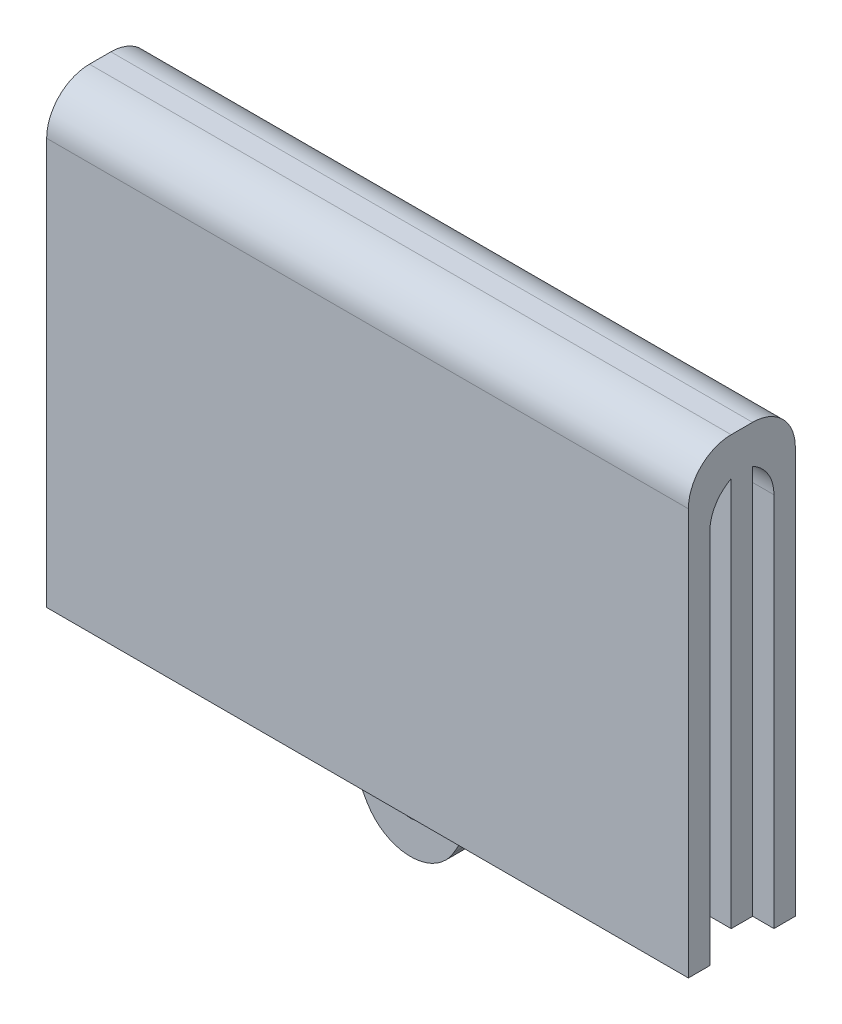
ISO-10303-21;
HEADER;
FILE_DESCRIPTION(('STEP AP214'),'2;1');
FILE_NAME('part.step','',(''),(''),'','','');
FILE_SCHEMA(('AUTOMOTIVE_DESIGN { 1 0 10303 214 1 1 1 1 }'));
ENDSEC;
DATA;
#1=APPLICATION_CONTEXT('core data for automotive mechanical design processes');
#2=APPLICATION_PROTOCOL_DEFINITION('international standard','automotive_design',2000,#1);
#3=PRODUCT_CONTEXT('',#1,'mechanical');
#4=PRODUCT('Part','Part','',(#3));
#5=PRODUCT_RELATED_PRODUCT_CATEGORY('part','',(#4));
#6=PRODUCT_DEFINITION_FORMATION('','',#4);
#7=PRODUCT_DEFINITION_CONTEXT('part definition',#1,'design');
#8=PRODUCT_DEFINITION('design','',#6,#7);
#9=PRODUCT_DEFINITION_SHAPE('','',#8);
#10=(LENGTH_UNIT() NAMED_UNIT(*) SI_UNIT(.MILLI.,.METRE.));
#11=(NAMED_UNIT(*) PLANE_ANGLE_UNIT() SI_UNIT($,.RADIAN.));
#12=(NAMED_UNIT(*) SI_UNIT($,.STERADIAN.) SOLID_ANGLE_UNIT());
#13=UNCERTAINTY_MEASURE_WITH_UNIT(LENGTH_MEASURE(1.E-05),#10,'distance_accuracy_value','');
#14=(GEOMETRIC_REPRESENTATION_CONTEXT(3) GLOBAL_UNCERTAINTY_ASSIGNED_CONTEXT((#13)) GLOBAL_UNIT_ASSIGNED_CONTEXT((#10,
#11,#12)) REPRESENTATION_CONTEXT('',''));
#15=CARTESIAN_POINT('',(0.,0.,0.));
#16=DIRECTION('',(0.,0.,1.));
#17=DIRECTION('',(1.,0.,0.));
#18=AXIS2_PLACEMENT_3D('',#15,#16,#17);
#19=CARTESIAN_POINT('',(-30.,40.,1.));
#20=DIRECTION('',(0.,0.,-1.));
#21=DIRECTION('',(-1.,0.,0.));
#22=AXIS2_PLACEMENT_3D('',#19,#20,#21);
#23=PLANE('',#22);
#24=CARTESIAN_POINT('',(0.0168395701474928,-4.49157611441039,1.));
#25=DIRECTION('',(0.,0.,-1.));
#26=DIRECTION('',(-1.,0.,0.));
#27=AXIS2_PLACEMENT_3D('',#24,#25,#26);
#28=CIRCLE('',#27,1.55);
#29=CARTESIAN_POINT('',(-1.53316042985251,-4.49157611441039,1.));
#30=VERTEX_POINT('',#29);
#31=EDGE_CURVE('E218',#30,#30,#28,.T.);
#32=ORIENTED_EDGE('',*,*,#31,.T.);
#33=EDGE_LOOP('',(#32));
#34=FACE_BOUND('',#33,.T.);
#35=DIRECTION('',(1.,0.,0.));
#36=VECTOR('',#35,1.);
#37=CARTESIAN_POINT('',(-30.,36.4381484104581,0.999999999999998));
#38=LINE('',#37,#36);
#39=CARTESIAN_POINT('',(-30.,36.4381484104581,1.));
#40=VERTEX_POINT('',#39);
#41=CARTESIAN_POINT('',(30.,36.4381484104581,0.999999999999998));
#42=VERTEX_POINT('',#41);
#43=EDGE_CURVE('E54',#40,#42,#38,.T.);
#44=ORIENTED_EDGE('',*,*,#43,.F.);
#45=DIRECTION('',(0.,-1.,0.));
#46=VECTOR('',#45,1.);
#47=CARTESIAN_POINT('',(-30.,40.,1.));
#48=LINE('',#47,#46);
#49=CARTESIAN_POINT('',(-30.,0.,1.));
#50=VERTEX_POINT('',#49);
#51=EDGE_CURVE('E308',#40,#50,#48,.T.);
#52=ORIENTED_EDGE('',*,*,#51,.T.);
#53=DIRECTION('',(1.,0.,0.));
#54=VECTOR('',#53,1.);
#55=CARTESIAN_POINT('',(-30.,0.,1.));
#56=LINE('',#55,#54);
#57=CARTESIAN_POINT('',(-7.96107829486734,0.,1.));
#58=VERTEX_POINT('',#57);
#59=EDGE_CURVE('E289',#50,#58,#56,.T.);
#60=ORIENTED_EDGE('',*,*,#59,.T.);
#61=DIRECTION('',(-0.499999999999998,0.86602540378444,0.));
#62=VECTOR('',#61,1.);
#63=CARTESIAN_POINT('',(-5.97080872115052,-3.447248022436,1.));
#64=LINE('',#63,#62);
#65=CARTESIAN_POINT('',(-4.02168931955825,-6.82322185601207,1.));
#66=VERTEX_POINT('',#65);
#67=EDGE_CURVE('E226',#66,#58,#64,.T.);
#68=ORIENTED_EDGE('',*,*,#67,.F.);
#69=CARTESIAN_POINT('',(0.0168395701474928,-4.49157611441039,1.));
#70=DIRECTION('',(0.,0.,-1.));
#71=DIRECTION('',(-1.,0.,0.));
#72=AXIS2_PLACEMENT_3D('',#69,#70,#71);
#73=CIRCLE('',#72,4.66329148320339);
#74=CARTESIAN_POINT('',(4.05536845985324,-6.8232218560121,1.));
#75=VERTEX_POINT('',#74);
#76=EDGE_CURVE('E223',#75,#66,#73,.T.);
#77=ORIENTED_EDGE('',*,*,#76,.F.);
#78=DIRECTION('',(0.500000000000004,0.866025403784436,0.));
#79=VECTOR('',#78,1.);
#80=CARTESIAN_POINT('',(5.99606807637177,-3.4618315179726,1.));
#81=LINE('',#80,#79);
#82=CARTESIAN_POINT('',(7.99475743516241,0.,1.));
#83=VERTEX_POINT('',#82);
#84=EDGE_CURVE('E221',#75,#83,#81,.T.);
#85=ORIENTED_EDGE('',*,*,#84,.T.);
#86=CARTESIAN_POINT('',(30.,0.,1.));
#87=VERTEX_POINT('',#86);
#88=EDGE_CURVE('E304',#83,#87,#56,.T.);
#89=ORIENTED_EDGE('',*,*,#88,.T.);
#90=DIRECTION('',(0.,-1.,0.));
#91=VECTOR('',#90,1.);
#92=CARTESIAN_POINT('',(30.,40.,1.));
#93=LINE('',#92,#91);
#94=EDGE_CURVE('E295',#42,#87,#93,.T.);
#95=ORIENTED_EDGE('',*,*,#94,.F.);
#96=EDGE_LOOP('',(#44,#52,#60,#68,#77,#85,#89,#95));
#97=FACE_BOUND('',#96,.T.);
#98=ADVANCED_FACE('F39',(#34,#97),#23,.F.);
#99=CARTESIAN_POINT('',(0.,0.,0.));
#100=DIRECTION('',(0.,-1.,0.));
#101=DIRECTION('',(0.,0.,-1.));
#102=AXIS2_PLACEMENT_3D('',#99,#100,#101);
#103=PLANE('',#102);
#104=ORIENTED_EDGE('',*,*,#88,.F.);
#105=DIRECTION('',(0.,0.,-1.));
#106=VECTOR('',#105,1.);
#107=CARTESIAN_POINT('',(7.99475743516241,0.,1.));
#108=LINE('',#107,#106);
#109=CARTESIAN_POINT('',(7.99475743516241,0.,-1.));
#110=VERTEX_POINT('',#109);
#111=EDGE_CURVE('E236',#83,#110,#108,.T.);
#112=ORIENTED_EDGE('',*,*,#111,.T.);
#113=DIRECTION('',(-1.,0.,0.));
#114=VECTOR('',#113,1.);
#115=CARTESIAN_POINT('',(-30.,0.,-1.));
#116=LINE('',#115,#114);
#117=CARTESIAN_POINT('',(30.,0.,-1.));
#118=VERTEX_POINT('',#117);
#119=EDGE_CURVE('E299',#118,#110,#116,.T.);
#120=ORIENTED_EDGE('',*,*,#119,.F.);
#121=DIRECTION('',(0.,0.,-1.));
#122=VECTOR('',#121,1.);
#123=CARTESIAN_POINT('',(30.,0.,1.));
#124=LINE('',#123,#122);
#125=EDGE_CURVE('E276',#87,#118,#124,.T.);
#126=ORIENTED_EDGE('',*,*,#125,.F.);
#127=EDGE_LOOP('',(#104,#112,#120,#126));
#128=FACE_BOUND('',#127,.T.);
#129=ADVANCED_FACE('F359',(#128),#103,.T.);
#130=CARTESIAN_POINT('',(30.,40.,1.));
#131=DIRECTION('',(-1.,0.,0.));
#132=DIRECTION('',(0.,0.,1.));
#133=AXIS2_PLACEMENT_3D('',#130,#131,#132);
#134=PLANE('',#133);
#135=ORIENTED_EDGE('',*,*,#125,.T.);
#136=DIRECTION('',(0.,-1.,0.));
#137=VECTOR('',#136,1.);
#138=CARTESIAN_POINT('',(30.,40.,-1.));
#139=LINE('',#138,#137);
#140=CARTESIAN_POINT('',(30.,36.4381484104581,-1.));
#141=VERTEX_POINT('',#140);
#142=EDGE_CURVE('E11',#141,#118,#139,.T.);
#143=ORIENTED_EDGE('',*,*,#142,.F.);
#144=CARTESIAN_POINT('',(30.,33.1344239159384,0.72864888392242));
#145=DIRECTION('',(-1.,0.,0.));
#146=DIRECTION('',(0.,0.,-1.));
#147=AXIS2_PLACEMENT_3D('',#144,#145,#146);
#148=CIRCLE('',#147,3.72864888392242);
#149=CARTESIAN_POINT('',(30.,33.1344239159384,-3.));
#150=VERTEX_POINT('',#149);
#151=EDGE_CURVE('E263',#141,#150,#148,.T.);
#152=ORIENTED_EDGE('',*,*,#151,.T.);
#153=DIRECTION('',(0.,-1.,0.));
#154=VECTOR('',#153,1.);
#155=CARTESIAN_POINT('',(30.,33.1344239159384,-3.));
#156=LINE('',#155,#154);
#157=CARTESIAN_POINT('',(30.,-1.99344008157751,-3.00000000000001));
#158=VERTEX_POINT('',#157);
#159=EDGE_CURVE('E266',#150,#158,#156,.T.);
#160=ORIENTED_EDGE('',*,*,#159,.T.);
#161=DIRECTION('',(0.,0.,-1.));
#162=VECTOR('',#161,1.);
#163=CARTESIAN_POINT('',(30.,-1.99344008157751,-3.00000000000001));
#164=LINE('',#163,#162);
#165=CARTESIAN_POINT('',(30.,-1.99344008157751,-5.00000000000001));
#166=VERTEX_POINT('',#165);
#167=EDGE_CURVE('E269',#158,#166,#164,.T.);
#168=ORIENTED_EDGE('',*,*,#167,.T.);
#169=DIRECTION('',(0.,1.,0.));
#170=VECTOR('',#169,1.);
#171=CARTESIAN_POINT('',(30.,36.,-5.));
#172=LINE('',#171,#170);
#173=CARTESIAN_POINT('',(30.,36.,-5.));
#174=VERTEX_POINT('',#173);
#175=EDGE_CURVE('E248',#166,#174,#172,.T.);
#176=ORIENTED_EDGE('',*,*,#175,.T.);
#177=CARTESIAN_POINT('',(30.,36.,-1.));
#178=DIRECTION('',(1.,0.,0.));
#179=DIRECTION('',(0.,0.,1.));
#180=AXIS2_PLACEMENT_3D('',#177,#178,#179);
#181=CIRCLE('',#180,4.);
#182=CARTESIAN_POINT('',(30.,40.,-1.));
#183=VERTEX_POINT('',#182);
#184=EDGE_CURVE('E239',#174,#183,#181,.T.);
#185=ORIENTED_EDGE('',*,*,#184,.T.);
#186=DIRECTION('',(0.,0.,-1.));
#187=VECTOR('',#186,1.);
#188=CARTESIAN_POINT('',(30.,40.,1.));
#189=LINE('',#188,#187);
#190=CARTESIAN_POINT('',(30.,40.,1.));
#191=VERTEX_POINT('',#190);
#192=EDGE_CURVE('E285',#191,#183,#189,.T.);
#193=ORIENTED_EDGE('',*,*,#192,.F.);
#194=CARTESIAN_POINT('',(30.,36.,0.999999999999998));
#195=DIRECTION('',(1.,0.,0.));
#196=DIRECTION('',(0.,0.,-1.));
#197=AXIS2_PLACEMENT_3D('',#194,#195,#196);
#198=CIRCLE('',#197,4.);
#199=CARTESIAN_POINT('',(30.,36.,5.));
#200=VERTEX_POINT('',#199);
#201=EDGE_CURVE('E203',#191,#200,#198,.T.);
#202=ORIENTED_EDGE('',*,*,#201,.T.);
#203=DIRECTION('',(0.,-1.,0.));
#204=VECTOR('',#203,1.);
#205=CARTESIAN_POINT('',(30.,36.,5.));
#206=LINE('',#205,#204);
#207=CARTESIAN_POINT('',(30.,-1.99344008157751,4.99999999999999));
#208=VERTEX_POINT('',#207);
#209=EDGE_CURVE('E169',#200,#208,#206,.T.);
#210=ORIENTED_EDGE('',*,*,#209,.T.);
#211=DIRECTION('',(0.,0.,-1.));
#212=VECTOR('',#211,1.);
#213=CARTESIAN_POINT('',(30.,-1.99344008157751,2.99999999999999));
#214=LINE('',#213,#212);
#215=CARTESIAN_POINT('',(30.,-1.99344008157751,2.99999999999999));
#216=VERTEX_POINT('',#215);
#217=EDGE_CURVE('E206',#208,#216,#214,.T.);
#218=ORIENTED_EDGE('',*,*,#217,.T.);
#219=DIRECTION('',(0.,1.,0.));
#220=VECTOR('',#219,1.);
#221=CARTESIAN_POINT('',(30.,33.1344239159384,3.));
#222=LINE('',#221,#220);
#223=CARTESIAN_POINT('',(30.,33.1344239159384,3.));
#224=VERTEX_POINT('',#223);
#225=EDGE_CURVE('E194',#216,#224,#222,.T.);
#226=ORIENTED_EDGE('',*,*,#225,.T.);
#227=CARTESIAN_POINT('',(30.,33.1344239159384,-0.728648883922424));
#228=DIRECTION('',(-1.,0.,0.));
#229=DIRECTION('',(0.,0.,1.));
#230=AXIS2_PLACEMENT_3D('',#227,#228,#229);
#231=CIRCLE('',#230,3.72864888392242);
#232=EDGE_CURVE('E191',#224,#42,#231,.T.);
#233=ORIENTED_EDGE('',*,*,#232,.T.);
#234=ORIENTED_EDGE('',*,*,#94,.T.);
#235=EDGE_LOOP('',(#135,#143,#152,#160,#168,#176,#185,#193,#202,#210,#218,#226,#233,#234));
#236=FACE_BOUND('',#235,.T.);
#237=ADVANCED_FACE('F41',(#236),#134,.F.);
#238=CARTESIAN_POINT('',(-30.,40.,-1.));
#239=DIRECTION('',(0.,0.,1.));
#240=DIRECTION('',(1.,0.,0.));
#241=AXIS2_PLACEMENT_3D('',#238,#239,#240);
#242=PLANE('',#241);
#243=DIRECTION('',(0.,-1.,0.));
#244=VECTOR('',#243,1.);
#245=CARTESIAN_POINT('',(-30.,40.,-1.));
#246=LINE('',#245,#244);
#247=CARTESIAN_POINT('',(-30.,36.4381484104581,-1.));
#248=VERTEX_POINT('',#247);
#249=CARTESIAN_POINT('',(-30.,0.,-1.));
#250=VERTEX_POINT('',#249);
#251=EDGE_CURVE('E47',#248,#250,#246,.T.);
#252=ORIENTED_EDGE('',*,*,#251,.F.);
#253=DIRECTION('',(1.,0.,0.));
#254=VECTOR('',#253,1.);
#255=CARTESIAN_POINT('',(-30.,36.4381484104581,-1.));
#256=LINE('',#255,#254);
#257=EDGE_CURVE('E260',#248,#141,#256,.T.);
#258=ORIENTED_EDGE('',*,*,#257,.T.);
#259=ORIENTED_EDGE('',*,*,#142,.T.);
#260=ORIENTED_EDGE('',*,*,#119,.T.);
#261=DIRECTION('',(0.500000000000004,0.866025403784436,0.));
#262=VECTOR('',#261,1.);
#263=CARTESIAN_POINT('',(5.99606807637177,-3.4618315179726,-1.));
#264=LINE('',#263,#262);
#265=CARTESIAN_POINT('',(4.05536845985324,-6.8232218560121,-1.));
#266=VERTEX_POINT('',#265);
#267=EDGE_CURVE('E231',#266,#110,#264,.T.);
#268=ORIENTED_EDGE('',*,*,#267,.F.);
#269=CARTESIAN_POINT('',(0.0168395701474928,-4.49157611441039,-1.));
#270=DIRECTION('',(0.,0.,-1.));
#271=DIRECTION('',(-1.,0.,0.));
#272=AXIS2_PLACEMENT_3D('',#269,#270,#271);
#273=CIRCLE('',#272,4.66329148320339);
#274=CARTESIAN_POINT('',(-4.02168931955825,-6.82322185601207,-1.));
#275=VERTEX_POINT('',#274);
#276=EDGE_CURVE('E233',#266,#275,#273,.T.);
#277=ORIENTED_EDGE('',*,*,#276,.T.);
#278=DIRECTION('',(-0.499999999999998,0.86602540378444,0.));
#279=VECTOR('',#278,1.);
#280=CARTESIAN_POINT('',(-5.97080872115052,-3.447248022436,-1.));
#281=LINE('',#280,#279);
#282=CARTESIAN_POINT('',(-7.96107829486734,0.,-1.));
#283=VERTEX_POINT('',#282);
#284=EDGE_CURVE('E62',#275,#283,#281,.T.);
#285=ORIENTED_EDGE('',*,*,#284,.T.);
#286=EDGE_CURVE('E298',#283,#250,#116,.T.);
#287=ORIENTED_EDGE('',*,*,#286,.T.);
#288=EDGE_LOOP('',(#252,#258,#259,#260,#268,#277,#285,#287));
#289=FACE_BOUND('',#288,.T.);
#290=CARTESIAN_POINT('',(0.0168395701474928,-4.49157611441039,-1.));
#291=DIRECTION('',(0.,0.,-1.));
#292=DIRECTION('',(-1.,0.,0.));
#293=AXIS2_PLACEMENT_3D('',#290,#291,#292);
#294=CIRCLE('',#293,1.55);
#295=CARTESIAN_POINT('',(-1.53316042985251,-4.49157611441039,-1.));
#296=VERTEX_POINT('',#295);
#297=EDGE_CURVE('E212',#296,#296,#294,.T.);
#298=ORIENTED_EDGE('',*,*,#297,.F.);
#299=EDGE_LOOP('',(#298));
#300=FACE_BOUND('',#299,.T.);
#301=ADVANCED_FACE('F352',(#289,#300),#242,.F.);
#302=CARTESIAN_POINT('',(-30.,40.,1.));
#303=DIRECTION('',(1.,0.,0.));
#304=DIRECTION('',(0.,0.,-1.));
#305=AXIS2_PLACEMENT_3D('',#302,#303,#304);
#306=PLANE('',#305);
#307=DIRECTION('',(0.,0.,1.));
#308=VECTOR('',#307,1.);
#309=CARTESIAN_POINT('',(-30.,0.,1.));
#310=LINE('',#309,#308);
#311=EDGE_CURVE('E302',#250,#50,#310,.T.);
#312=ORIENTED_EDGE('',*,*,#311,.T.);
#313=ORIENTED_EDGE('',*,*,#51,.F.);
#314=CARTESIAN_POINT('',(-30.,33.1344239159384,-0.728648883922424));
#315=DIRECTION('',(-1.,0.,0.));
#316=DIRECTION('',(0.,0.,1.));
#317=AXIS2_PLACEMENT_3D('',#314,#315,#316);
#318=CIRCLE('',#317,3.72864888392242);
#319=CARTESIAN_POINT('',(-30.,33.1344239159384,3.));
#320=VERTEX_POINT('',#319);
#321=EDGE_CURVE('E175',#320,#40,#318,.T.);
#322=ORIENTED_EDGE('',*,*,#321,.F.);
#323=DIRECTION('',(0.,1.,0.));
#324=VECTOR('',#323,1.);
#325=CARTESIAN_POINT('',(-30.,33.1344239159384,3.));
#326=LINE('',#325,#324);
#327=CARTESIAN_POINT('',(-30.,-1.99344008157751,2.99999999999999));
#328=VERTEX_POINT('',#327);
#329=EDGE_CURVE('E198',#328,#320,#326,.T.);
#330=ORIENTED_EDGE('',*,*,#329,.F.);
#331=DIRECTION('',(0.,0.,-1.));
#332=VECTOR('',#331,1.);
#333=CARTESIAN_POINT('',(-30.,-1.99344008157751,2.99999999999999));
#334=LINE('',#333,#332);
#335=CARTESIAN_POINT('',(-30.,-1.99344008157751,4.99999999999999));
#336=VERTEX_POINT('',#335);
#337=EDGE_CURVE('E186',#336,#328,#334,.T.);
#338=ORIENTED_EDGE('',*,*,#337,.F.);
#339=DIRECTION('',(0.,-1.,0.));
#340=VECTOR('',#339,1.);
#341=CARTESIAN_POINT('',(-30.,36.,5.));
#342=LINE('',#341,#340);
#343=CARTESIAN_POINT('',(-30.,36.,5.));
#344=VERTEX_POINT('',#343);
#345=EDGE_CURVE('E167',#344,#336,#342,.T.);
#346=ORIENTED_EDGE('',*,*,#345,.F.);
#347=CARTESIAN_POINT('',(-30.,36.,0.999999999999998));
#348=DIRECTION('',(1.,0.,0.));
#349=DIRECTION('',(0.,0.,-1.));
#350=AXIS2_PLACEMENT_3D('',#347,#348,#349);
#351=CIRCLE('',#350,4.);
#352=CARTESIAN_POINT('',(-30.,40.,1.));
#353=VERTEX_POINT('',#352);
#354=EDGE_CURVE('E183',#353,#344,#351,.T.);
#355=ORIENTED_EDGE('',*,*,#354,.F.);
#356=DIRECTION('',(0.,0.,1.));
#357=VECTOR('',#356,1.);
#358=CARTESIAN_POINT('',(-30.,40.,1.));
#359=LINE('',#358,#357);
#360=CARTESIAN_POINT('',(-30.,40.,-1.));
#361=VERTEX_POINT('',#360);
#362=EDGE_CURVE('E292',#361,#353,#359,.T.);
#363=ORIENTED_EDGE('',*,*,#362,.F.);
#364=CARTESIAN_POINT('',(-30.,36.,-1.));
#365=DIRECTION('',(1.,0.,0.));
#366=DIRECTION('',(0.,0.,1.));
#367=AXIS2_PLACEMENT_3D('',#364,#365,#366);
#368=CIRCLE('',#367,4.);
#369=CARTESIAN_POINT('',(-30.,36.,-5.));
#370=VERTEX_POINT('',#369);
#371=EDGE_CURVE('E245',#370,#361,#368,.T.);
#372=ORIENTED_EDGE('',*,*,#371,.F.);
#373=DIRECTION('',(0.,1.,0.));
#374=VECTOR('',#373,1.);
#375=CARTESIAN_POINT('',(-30.,36.,-5.));
#376=LINE('',#375,#374);
#377=CARTESIAN_POINT('',(-30.,-1.99344008157751,-5.00000000000001));
#378=VERTEX_POINT('',#377);
#379=EDGE_CURVE('E257',#378,#370,#376,.T.);
#380=ORIENTED_EDGE('',*,*,#379,.F.);
#381=DIRECTION('',(0.,0.,-1.));
#382=VECTOR('',#381,1.);
#383=CARTESIAN_POINT('',(-30.,-1.99344008157751,-3.00000000000001));
#384=LINE('',#383,#382);
#385=CARTESIAN_POINT('',(-30.,-1.99344008157751,-3.00000000000001));
#386=VERTEX_POINT('',#385);
#387=EDGE_CURVE('E254',#386,#378,#384,.T.);
#388=ORIENTED_EDGE('',*,*,#387,.F.);
#389=DIRECTION('',(0.,-1.,0.));
#390=VECTOR('',#389,1.);
#391=CARTESIAN_POINT('',(-30.,33.1344239159384,-3.));
#392=LINE('',#391,#390);
#393=CARTESIAN_POINT('',(-30.,33.1344239159384,-3.));
#394=VERTEX_POINT('',#393);
#395=EDGE_CURVE('E251',#394,#386,#392,.T.);
#396=ORIENTED_EDGE('',*,*,#395,.F.);
#397=CARTESIAN_POINT('',(-30.,33.1344239159384,0.72864888392242));
#398=DIRECTION('',(-1.,0.,0.));
#399=DIRECTION('',(0.,0.,-1.));
#400=AXIS2_PLACEMENT_3D('',#397,#398,#399);
#401=CIRCLE('',#400,3.72864888392242);
#402=EDGE_CURVE('E247',#248,#394,#401,.T.);
#403=ORIENTED_EDGE('',*,*,#402,.F.);
#404=ORIENTED_EDGE('',*,*,#251,.T.);
#405=EDGE_LOOP('',(#312,#313,#322,#330,#338,#346,#355,#363,#372,#380,#388,#396,#403,#404));
#406=FACE_BOUND('',#405,.T.);
#407=ADVANCED_FACE('F181',(#406),#306,.F.);
#408=CARTESIAN_POINT('',(0.,40.,0.));
#409=DIRECTION('',(0.,-1.,0.));
#410=DIRECTION('',(0.,0.,-1.));
#411=AXIS2_PLACEMENT_3D('',#408,#409,#410);
#412=PLANE('',#411);
#413=ORIENTED_EDGE('',*,*,#192,.T.);
#414=DIRECTION('',(-1.,0.,0.));
#415=VECTOR('',#414,1.);
#416=CARTESIAN_POINT('',(-30.,40.,-1.));
#417=LINE('',#416,#415);
#418=EDGE_CURVE('E288',#183,#361,#417,.T.);
#419=ORIENTED_EDGE('',*,*,#418,.T.);
#420=ORIENTED_EDGE('',*,*,#362,.T.);
#421=DIRECTION('',(1.,0.,0.));
#422=VECTOR('',#421,1.);
#423=CARTESIAN_POINT('',(-30.,40.,1.));
#424=LINE('',#423,#422);
#425=EDGE_CURVE('E190',#353,#191,#424,.T.);
#426=ORIENTED_EDGE('',*,*,#425,.T.);
#427=EDGE_LOOP('',(#413,#419,#420,#426));
#428=FACE_BOUND('',#427,.T.);
#429=ADVANCED_FACE('F335',(#428),#412,.F.);
#430=DIRECTION('',(0.,0.,-1.));
#431=VECTOR('',#430,1.);
#432=CARTESIAN_POINT('',(-7.96107829486734,0.,1.));
#433=LINE('',#432,#431);
#434=EDGE_CURVE('E240',#58,#283,#433,.T.);
#435=ORIENTED_EDGE('',*,*,#434,.F.);
#436=ORIENTED_EDGE('',*,*,#59,.F.);
#437=ORIENTED_EDGE('',*,*,#311,.F.);
#438=ORIENTED_EDGE('',*,*,#286,.F.);
#439=EDGE_LOOP('',(#435,#436,#437,#438));
#440=FACE_BOUND('',#439,.T.);
#441=ADVANCED_FACE('F318',(#440),#103,.T.);
#442=CARTESIAN_POINT('',(-30.,36.,-1.));
#443=DIRECTION('',(1.,0.,0.));
#444=DIRECTION('',(0.,0.,-1.));
#445=AXIS2_PLACEMENT_3D('',#442,#443,#444);
#446=CYLINDRICAL_SURFACE('',#445,4.);
#447=ORIENTED_EDGE('',*,*,#184,.F.);
#448=DIRECTION('',(1.,0.,0.));
#449=VECTOR('',#448,1.);
#450=CARTESIAN_POINT('',(-30.,36.,-5.));
#451=LINE('',#450,#449);
#452=EDGE_CURVE('E274',#370,#174,#451,.T.);
#453=ORIENTED_EDGE('',*,*,#452,.F.);
#454=ORIENTED_EDGE('',*,*,#371,.T.);
#455=ORIENTED_EDGE('',*,*,#418,.F.);
#456=EDGE_LOOP('',(#447,#453,#454,#455));
#457=FACE_BOUND('',#456,.T.);
#458=ADVANCED_FACE('F439',(#457),#446,.T.);
#459=CARTESIAN_POINT('',(-30.,36.,-5.));
#460=DIRECTION('',(0.,0.,-1.));
#461=DIRECTION('',(0.,1.,0.));
#462=AXIS2_PLACEMENT_3D('',#459,#460,#461);
#463=PLANE('',#462);
#464=ORIENTED_EDGE('',*,*,#175,.F.);
#465=DIRECTION('',(1.,0.,0.));
#466=VECTOR('',#465,1.);
#467=CARTESIAN_POINT('',(-30.,-1.99344008157751,-5.00000000000001));
#468=LINE('',#467,#466);
#469=EDGE_CURVE('E277',#378,#166,#468,.T.);
#470=ORIENTED_EDGE('',*,*,#469,.F.);
#471=ORIENTED_EDGE('',*,*,#379,.T.);
#472=ORIENTED_EDGE('',*,*,#452,.T.);
#473=EDGE_LOOP('',(#464,#470,#471,#472));
#474=FACE_BOUND('',#473,.T.);
#475=ADVANCED_FACE('F342',(#474),#463,.T.);
#476=CARTESIAN_POINT('',(-30.,-1.99344008157751,-3.00000000000001));
#477=DIRECTION('',(0.,-1.,0.));
#478=DIRECTION('',(0.,0.,-1.));
#479=AXIS2_PLACEMENT_3D('',#476,#477,#478);
#480=PLANE('',#479);
#481=ORIENTED_EDGE('',*,*,#167,.F.);
#482=DIRECTION('',(1.,0.,0.));
#483=VECTOR('',#482,1.);
#484=CARTESIAN_POINT('',(-30.,-1.99344008157751,-3.00000000000001));
#485=LINE('',#484,#483);
#486=EDGE_CURVE('E279',#386,#158,#485,.T.);
#487=ORIENTED_EDGE('',*,*,#486,.F.);
#488=ORIENTED_EDGE('',*,*,#387,.T.);
#489=ORIENTED_EDGE('',*,*,#469,.T.);
#490=EDGE_LOOP('',(#481,#487,#488,#489));
#491=FACE_BOUND('',#490,.T.);
#492=ADVANCED_FACE('F345',(#491),#480,.T.);
#493=CARTESIAN_POINT('',(-30.,33.1344239159384,-3.));
#494=DIRECTION('',(0.,0.,1.));
#495=DIRECTION('',(0.,-1.,0.));
#496=AXIS2_PLACEMENT_3D('',#493,#494,#495);
#497=PLANE('',#496);
#498=ORIENTED_EDGE('',*,*,#159,.F.);
#499=DIRECTION('',(1.,0.,0.));
#500=VECTOR('',#499,1.);
#501=CARTESIAN_POINT('',(-30.,33.1344239159384,-3.));
#502=LINE('',#501,#500);
#503=EDGE_CURVE('E281',#394,#150,#502,.T.);
#504=ORIENTED_EDGE('',*,*,#503,.F.);
#505=ORIENTED_EDGE('',*,*,#395,.T.);
#506=ORIENTED_EDGE('',*,*,#486,.T.);
#507=EDGE_LOOP('',(#498,#504,#505,#506));
#508=FACE_BOUND('',#507,.T.);
#509=ADVANCED_FACE('F348',(#508),#497,.T.);
#510=CARTESIAN_POINT('',(-30.,33.1344239159384,0.72864888392242));
#511=DIRECTION('',(1.,0.,0.));
#512=DIRECTION('',(0.,0.,-1.));
#513=AXIS2_PLACEMENT_3D('',#510,#511,#512);
#514=CYLINDRICAL_SURFACE('',#513,3.72864888392242);
#515=ORIENTED_EDGE('',*,*,#151,.F.);
#516=ORIENTED_EDGE('',*,*,#257,.F.);
#517=ORIENTED_EDGE('',*,*,#402,.T.);
#518=ORIENTED_EDGE('',*,*,#503,.T.);
#519=EDGE_LOOP('',(#515,#516,#517,#518));
#520=FACE_BOUND('',#519,.T.);
#521=ADVANCED_FACE('F350',(#520),#514,.F.);
#522=CARTESIAN_POINT('',(5.99606807637177,-3.4618315179726,1.));
#523=DIRECTION('',(-0.866025403784436,0.500000000000004,0.));
#524=DIRECTION('',(-0.500000000000004,-0.866025403784436,0.));
#525=AXIS2_PLACEMENT_3D('',#522,#523,#524);
#526=PLANE('',#525);
#527=ORIENTED_EDGE('',*,*,#267,.T.);
#528=ORIENTED_EDGE('',*,*,#111,.F.);
#529=ORIENTED_EDGE('',*,*,#84,.F.);
#530=DIRECTION('',(0.,0.,-1.));
#531=VECTOR('',#530,1.);
#532=CARTESIAN_POINT('',(4.05536845985324,-6.8232218560121,1.));
#533=LINE('',#532,#531);
#534=EDGE_CURVE('E228',#75,#266,#533,.T.);
#535=ORIENTED_EDGE('',*,*,#534,.T.);
#536=EDGE_LOOP('',(#527,#528,#529,#535));
#537=FACE_BOUND('',#536,.T.);
#538=ADVANCED_FACE('F371',(#537),#526,.F.);
#539=CARTESIAN_POINT('',(-5.97080872115052,-3.447248022436,1.));
#540=DIRECTION('',(-0.86602540378444,-0.499999999999998,0.));
#541=DIRECTION('',(0.499999999999998,-0.86602540378444,0.));
#542=AXIS2_PLACEMENT_3D('',#539,#540,#541);
#543=PLANE('',#542);
#544=ORIENTED_EDGE('',*,*,#284,.F.);
#545=DIRECTION('',(0.,0.,-1.));
#546=VECTOR('',#545,1.);
#547=CARTESIAN_POINT('',(-4.02168931955825,-6.82322185601207,1.));
#548=LINE('',#547,#546);
#549=EDGE_CURVE('E242',#66,#275,#548,.T.);
#550=ORIENTED_EDGE('',*,*,#549,.F.);
#551=ORIENTED_EDGE('',*,*,#67,.T.);
#552=ORIENTED_EDGE('',*,*,#434,.T.);
#553=EDGE_LOOP('',(#544,#550,#551,#552));
#554=FACE_BOUND('',#553,.T.);
#555=ADVANCED_FACE('F368',(#554),#543,.T.);
#556=CARTESIAN_POINT('',(0.0168395701474928,-4.49157611441039,1.));
#557=DIRECTION('',(0.,0.,-1.));
#558=DIRECTION('',(-1.,0.,0.));
#559=AXIS2_PLACEMENT_3D('',#556,#557,#558);
#560=CYLINDRICAL_SURFACE('',#559,1.55);
#561=ORIENTED_EDGE('',*,*,#31,.F.);
#562=EDGE_LOOP('',(#561));
#563=FACE_BOUND('',#562,.T.);
#564=ORIENTED_EDGE('',*,*,#297,.T.);
#565=EDGE_LOOP('',(#564));
#566=FACE_BOUND('',#565,.T.);
#567=ADVANCED_FACE('F370',(#563,#566),#560,.F.);
#568=CARTESIAN_POINT('',(0.0168395701474928,-4.49157611441039,1.));
#569=DIRECTION('',(0.,0.,-1.));
#570=DIRECTION('',(-1.,0.,0.));
#571=AXIS2_PLACEMENT_3D('',#568,#569,#570);
#572=CYLINDRICAL_SURFACE('',#571,4.66329148320339);
#573=ORIENTED_EDGE('',*,*,#276,.F.);
#574=ORIENTED_EDGE('',*,*,#534,.F.);
#575=ORIENTED_EDGE('',*,*,#76,.T.);
#576=ORIENTED_EDGE('',*,*,#549,.T.);
#577=EDGE_LOOP('',(#573,#574,#575,#576));
#578=FACE_BOUND('',#577,.T.);
#579=ADVANCED_FACE('F365',(#578),#572,.T.);
#580=CARTESIAN_POINT('',(-30.,36.,0.999999999999998));
#581=DIRECTION('',(1.,0.,0.));
#582=DIRECTION('',(0.,0.,-1.));
#583=AXIS2_PLACEMENT_3D('',#580,#581,#582);
#584=CYLINDRICAL_SURFACE('',#583,4.);
#585=ORIENTED_EDGE('',*,*,#201,.F.);
#586=ORIENTED_EDGE('',*,*,#425,.F.);
#587=ORIENTED_EDGE('',*,*,#354,.T.);
#588=DIRECTION('',(1.,0.,0.));
#589=VECTOR('',#588,1.);
#590=CARTESIAN_POINT('',(-30.,36.,5.));
#591=LINE('',#590,#589);
#592=EDGE_CURVE('E164',#344,#200,#591,.T.);
#593=ORIENTED_EDGE('',*,*,#592,.T.);
#594=EDGE_LOOP('',(#585,#586,#587,#593));
#595=FACE_BOUND('',#594,.T.);
#596=ADVANCED_FACE('F189',(#595),#584,.T.);
#597=CARTESIAN_POINT('',(-30.,33.1344239159384,-0.728648883922424));
#598=DIRECTION('',(1.,0.,0.));
#599=DIRECTION('',(0.,0.,-1.));
#600=AXIS2_PLACEMENT_3D('',#597,#598,#599);
#601=CYLINDRICAL_SURFACE('',#600,3.72864888392242);
#602=ORIENTED_EDGE('',*,*,#232,.F.);
#603=DIRECTION('',(1.,0.,0.));
#604=VECTOR('',#603,1.);
#605=CARTESIAN_POINT('',(-30.,33.1344239159384,3.));
#606=LINE('',#605,#604);
#607=EDGE_CURVE('E213',#320,#224,#606,.T.);
#608=ORIENTED_EDGE('',*,*,#607,.F.);
#609=ORIENTED_EDGE('',*,*,#321,.T.);
#610=ORIENTED_EDGE('',*,*,#43,.T.);
#611=EDGE_LOOP('',(#602,#608,#609,#610));
#612=FACE_BOUND('',#611,.T.);
#613=ADVANCED_FACE('F324',(#612),#601,.F.);
#614=CARTESIAN_POINT('',(-30.,33.1344239159384,3.));
#615=DIRECTION('',(0.,0.,-1.));
#616=DIRECTION('',(0.,1.,0.));
#617=AXIS2_PLACEMENT_3D('',#614,#615,#616);
#618=PLANE('',#617);
#619=ORIENTED_EDGE('',*,*,#225,.F.);
#620=DIRECTION('',(1.,0.,0.));
#621=VECTOR('',#620,1.);
#622=CARTESIAN_POINT('',(-30.,-1.99344008157751,2.99999999999999));
#623=LINE('',#622,#621);
#624=EDGE_CURVE('E215',#328,#216,#623,.T.);
#625=ORIENTED_EDGE('',*,*,#624,.F.);
#626=ORIENTED_EDGE('',*,*,#329,.T.);
#627=ORIENTED_EDGE('',*,*,#607,.T.);
#628=EDGE_LOOP('',(#619,#625,#626,#627));
#629=FACE_BOUND('',#628,.T.);
#630=ADVANCED_FACE('F327',(#629),#618,.T.);
#631=CARTESIAN_POINT('',(-30.,-1.99344008157751,2.99999999999999));
#632=DIRECTION('',(0.,-1.,0.));
#633=DIRECTION('',(0.,0.,-1.));
#634=AXIS2_PLACEMENT_3D('',#631,#632,#633);
#635=PLANE('',#634);
#636=ORIENTED_EDGE('',*,*,#217,.F.);
#637=DIRECTION('',(1.,0.,0.));
#638=VECTOR('',#637,1.);
#639=CARTESIAN_POINT('',(-30.,-1.99344008157751,4.99999999999999));
#640=LINE('',#639,#638);
#641=EDGE_CURVE('E174',#336,#208,#640,.T.);
#642=ORIENTED_EDGE('',*,*,#641,.F.);
#643=ORIENTED_EDGE('',*,*,#337,.T.);
#644=ORIENTED_EDGE('',*,*,#624,.T.);
#645=EDGE_LOOP('',(#636,#642,#643,#644));
#646=FACE_BOUND('',#645,.T.);
#647=ADVANCED_FACE('F330',(#646),#635,.T.);
#648=CARTESIAN_POINT('',(-30.,36.,5.));
#649=DIRECTION('',(0.,0.,1.));
#650=DIRECTION('',(0.,-1.,0.));
#651=AXIS2_PLACEMENT_3D('',#648,#649,#650);
#652=PLANE('',#651);
#653=ORIENTED_EDGE('',*,*,#209,.F.);
#654=ORIENTED_EDGE('',*,*,#592,.F.);
#655=ORIENTED_EDGE('',*,*,#345,.T.);
#656=ORIENTED_EDGE('',*,*,#641,.T.);
#657=EDGE_LOOP('',(#653,#654,#655,#656));
#658=FACE_BOUND('',#657,.T.);
#659=ADVANCED_FACE('F166',(#658),#652,.T.);
#660=CLOSED_SHELL('',(#98,#129,#237,#301,#407,#429,#441,#458,#475,#492,#509,#521,#538,#555,#567,
#579,#596,#613,#630,#647,#659));
#661=MANIFOLD_SOLID_BREP('B2',#660);
#662=ADVANCED_BREP_SHAPE_REPRESENTATION('',(#18,#661),#14);
#663=SHAPE_DEFINITION_REPRESENTATION(#9,#662);
ENDSEC;
END-ISO-10303-21;
